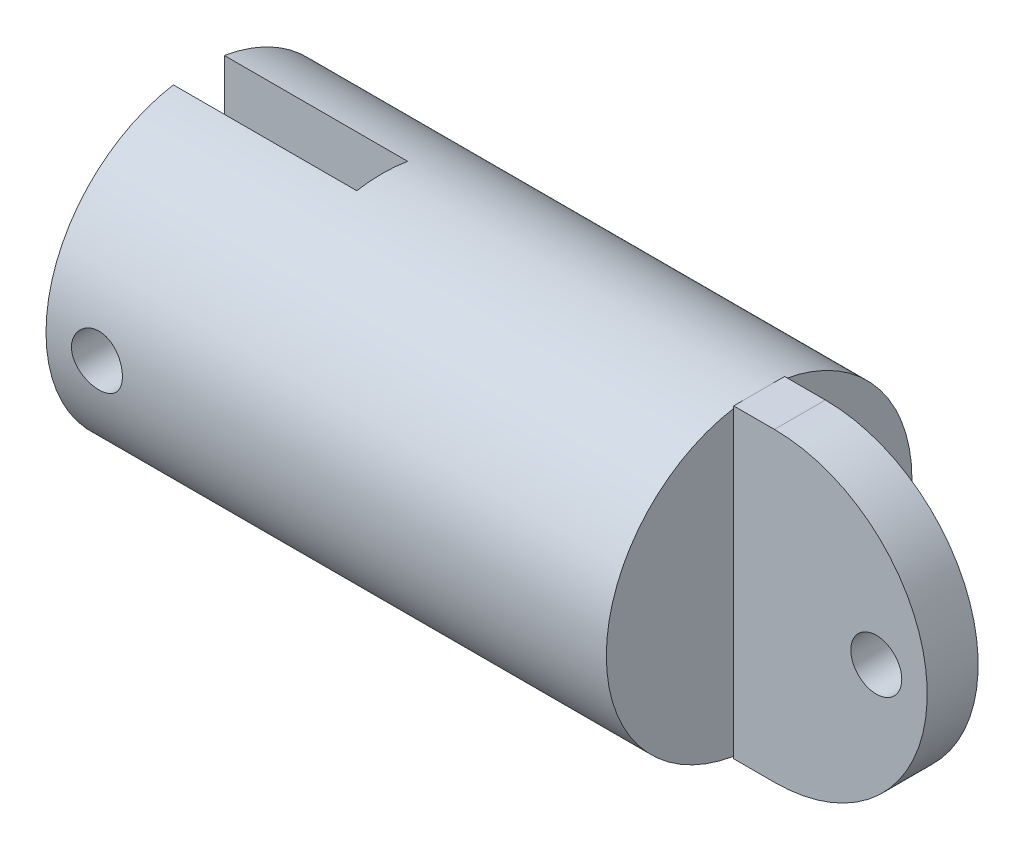
ISO-10303-21;
HEADER;
FILE_DESCRIPTION(('STEP AP214'),'2;1');
FILE_NAME('part.step','',(''),(''),'','','');
FILE_SCHEMA(('AUTOMOTIVE_DESIGN { 1 0 10303 214 1 1 1 1 }'));
ENDSEC;
DATA;
#1=APPLICATION_CONTEXT('core data for automotive mechanical design processes');
#2=APPLICATION_PROTOCOL_DEFINITION('international standard','automotive_design',2000,#1);
#3=PRODUCT_CONTEXT('',#1,'mechanical');
#4=PRODUCT('Part','Part','',(#3));
#5=PRODUCT_RELATED_PRODUCT_CATEGORY('part','',(#4));
#6=PRODUCT_DEFINITION_FORMATION('','',#4);
#7=PRODUCT_DEFINITION_CONTEXT('part definition',#1,'design');
#8=PRODUCT_DEFINITION('design','',#6,#7);
#9=PRODUCT_DEFINITION_SHAPE('','',#8);
#10=(LENGTH_UNIT() NAMED_UNIT(*) SI_UNIT(.MILLI.,.METRE.));
#11=(NAMED_UNIT(*) PLANE_ANGLE_UNIT() SI_UNIT($,.RADIAN.));
#12=(NAMED_UNIT(*) SI_UNIT($,.STERADIAN.) SOLID_ANGLE_UNIT());
#13=UNCERTAINTY_MEASURE_WITH_UNIT(LENGTH_MEASURE(1.E-05),#10,'distance_accuracy_value','');
#14=(GEOMETRIC_REPRESENTATION_CONTEXT(3) GLOBAL_UNCERTAINTY_ASSIGNED_CONTEXT((#13)) GLOBAL_UNIT_ASSIGNED_CONTEXT((#10,
#11,#12)) REPRESENTATION_CONTEXT('',''));
#15=CARTESIAN_POINT('',(0.,0.,0.));
#16=DIRECTION('',(0.,0.,1.));
#17=DIRECTION('',(1.,0.,0.));
#18=AXIS2_PLACEMENT_3D('',#15,#16,#17);
#19=CARTESIAN_POINT('',(0.,0.,0.));
#20=DIRECTION('',(1.,0.,0.));
#21=DIRECTION('',(0.,0.,-1.));
#22=AXIS2_PLACEMENT_3D('',#19,#20,#21);
#23=PLANE('',#22);
#24=DIRECTION('',(0.,1.,0.));
#25=VECTOR('',#24,1.);
#26=CARTESIAN_POINT('',(0.,15.,-2.5));
#27=LINE('',#26,#25);
#28=CARTESIAN_POINT('',(0.,-14.790199457749,-2.5));
#29=VERTEX_POINT('',#28);
#30=CARTESIAN_POINT('',(0.,14.790199457749,-2.5));
#31=VERTEX_POINT('',#30);
#32=EDGE_CURVE('E11',#29,#31,#27,.T.);
#33=ORIENTED_EDGE('',*,*,#32,.F.);
#34=CARTESIAN_POINT('',(0.,0.,0.));
#35=DIRECTION('',(1.,0.,0.));
#36=DIRECTION('',(0.,0.,-1.));
#37=AXIS2_PLACEMENT_3D('',#34,#35,#36);
#38=CIRCLE('',#37,15.);
#39=EDGE_CURVE('E271',#29,#31,#38,.T.);
#40=ORIENTED_EDGE('',*,*,#39,.T.);
#41=EDGE_LOOP('',(#33,#40));
#42=FACE_BOUND('',#41,.T.);
#43=ADVANCED_FACE('F38',(#42),#23,.T.);
#44=CARTESIAN_POINT('',(-55.,0.,0.));
#45=DIRECTION('',(1.,0.,0.));
#46=DIRECTION('',(0.,0.,-1.));
#47=AXIS2_PLACEMENT_3D('',#44,#45,#46);
#48=PLANE('',#47);
#49=CARTESIAN_POINT('',(-55.,0.,0.));
#50=DIRECTION('',(1.,0.,0.));
#51=DIRECTION('',(0.,0.,-1.));
#52=AXIS2_PLACEMENT_3D('',#49,#50,#51);
#53=CIRCLE('',#52,15.);
#54=CARTESIAN_POINT('',(-55.,-14.790199457749,-2.5));
#55=VERTEX_POINT('',#54);
#56=CARTESIAN_POINT('',(-55.,14.790199457749,-2.5));
#57=VERTEX_POINT('',#56);
#58=EDGE_CURVE('E255',#55,#57,#53,.T.);
#59=ORIENTED_EDGE('',*,*,#58,.F.);
#60=DIRECTION('',(0.,1.,0.));
#61=VECTOR('',#60,1.);
#62=CARTESIAN_POINT('',(-55.,0.,-2.5));
#63=LINE('',#62,#61);
#64=EDGE_CURVE('E256',#55,#57,#63,.T.);
#65=ORIENTED_EDGE('',*,*,#64,.T.);
#66=EDGE_LOOP('',(#59,#65));
#67=FACE_BOUND('',#66,.T.);
#68=ADVANCED_FACE('F235',(#67),#48,.F.);
#69=CARTESIAN_POINT('',(-55.,0.,0.));
#70=DIRECTION('',(1.,0.,0.));
#71=DIRECTION('',(0.,0.,-1.));
#72=AXIS2_PLACEMENT_3D('',#69,#70,#71);
#73=CYLINDRICAL_SURFACE('',#72,15.);
#74=CARTESIAN_POINT('',(-47.5,0.,-15.));
#75=CARTESIAN_POINT('',(-47.5000055889478,-0.139390904958215,-14.9999976116882));
#76=CARTESIAN_POINT('',(-47.5116972749689,-0.278857881838821,-14.9980367791303));
#77=CARTESIAN_POINT('',(-47.5581356587653,-0.553880221673043,-14.9904034494139));
#78=CARTESIAN_POINT('',(-47.5929035569116,-0.689431867959247,-14.9847275392389));
#79=CARTESIAN_POINT('',(-47.6844154485928,-0.952604747212645,-14.9703006823645));
#80=CARTESIAN_POINT('',(-47.7411414656406,-1.0802323684319,-14.9615522515919));
#81=CARTESIAN_POINT('',(-47.8749122920524,-1.32414184197795,-14.9419422708207));
#82=CARTESIAN_POINT('',(-47.951954777483,-1.44042498987859,-14.9310809625443));
#83=CARTESIAN_POINT('',(-48.1249550838205,-1.65947261429168,-14.9083331745831));
#84=CARTESIAN_POINT('',(-48.2210691146361,-1.76211290353497,-14.8964387181486));
#85=CARTESIAN_POINT('',(-48.4291479684728,-1.94988849865993,-14.8730262687673));
#86=CARTESIAN_POINT('',(-48.5411137914566,-2.03502269939097,-14.8615082996267));
#87=CARTESIAN_POINT('',(-48.7785709661971,-2.18586712560514,-14.8400756575978));
#88=CARTESIAN_POINT('',(-48.9041413368048,-2.25145455286101,-14.8301712909164));
#89=CARTESIAN_POINT('',(-49.1647095643006,-2.36055836541122,-14.8131978979467));
#90=CARTESIAN_POINT('',(-49.2997067836776,-2.40407624156562,-14.8061286801431));
#91=CARTESIAN_POINT('',(-49.5739802748565,-2.46741437778481,-14.7957053684276));
#92=CARTESIAN_POINT('',(-49.7132057365014,-2.4874490291354,-14.792317684857));
#93=CARTESIAN_POINT('',(-49.9930802768835,-2.50391672528988,-14.7895393893665));
#94=CARTESIAN_POINT('',(-50.1337292541673,-2.500351440389,-14.7901484945721));
#95=CARTESIAN_POINT('',(-50.4109278612755,-2.46989509839615,-14.7952642886356));
#96=CARTESIAN_POINT('',(-50.5475048035452,-2.44324488188977,-14.7997307331892));
#97=CARTESIAN_POINT('',(-50.8142213178291,-2.36775314040345,-14.8119949521101));
#98=CARTESIAN_POINT('',(-50.9443606688886,-2.31891085431974,-14.8197928407327));
#99=CARTESIAN_POINT('',(-51.1952288234409,-2.20017724609391,-14.837884793341));
#100=CARTESIAN_POINT('',(-51.3159094060812,-2.13018591387971,-14.8481906710733));
#101=CARTESIAN_POINT('',(-51.5439044005384,-1.97121201755743,-14.8701291841501));
#102=CARTESIAN_POINT('',(-51.6512177324549,-1.88222792065429,-14.8817619265429));
#103=CARTESIAN_POINT('',(-51.8508260858073,-1.68648221215906,-14.9052202787979));
#104=CARTESIAN_POINT('',(-51.9429185185401,-1.57951396387313,-14.9170464923165));
#105=CARTESIAN_POINT('',(-52.1078777626654,-1.35153524898165,-14.9394260139672));
#106=CARTESIAN_POINT('',(-52.1807444501832,-1.23052469190642,-14.9499793138975));
#107=CARTESIAN_POINT('',(-52.3052022271363,-0.97770591616671,-14.9686389289291));
#108=CARTESIAN_POINT('',(-52.3567754193313,-0.84588872556466,-14.9767431840745));
#109=CARTESIAN_POINT('',(-52.436994215246,-0.575298345602731,-14.9895750301266));
#110=CARTESIAN_POINT('',(-52.4656417369737,-0.436525739179469,-14.9943029035047));
#111=CARTESIAN_POINT('',(-52.4989213584611,-0.157709901301626,-14.9998112984269));
#112=CARTESIAN_POINT('',(-52.5038315718056,-0.017700737151014,-15.0006375301278));
#113=CARTESIAN_POINT('',(-52.4902386555719,0.261139772889886,-14.9983747442117));
#114=CARTESIAN_POINT('',(-52.4717364268663,0.399971163892037,-14.9952858772412));
#115=CARTESIAN_POINT('',(-52.4120751506645,0.671656175546762,-14.985568269382));
#116=CARTESIAN_POINT('',(-52.3710537916099,0.804540868385376,-14.9789610480131));
#117=CARTESIAN_POINT('',(-52.2676654818005,1.06154688486044,-14.9629446445536));
#118=CARTESIAN_POINT('',(-52.2052973323647,1.18566771590972,-14.9535353051202));
#119=CARTESIAN_POINT('',(-52.0603488753032,1.42283068946896,-14.9328451630241));
#120=CARTESIAN_POINT('',(-51.9775948438328,1.53576525093715,-14.9215485588702));
#121=CARTESIAN_POINT('',(-51.7944626846149,1.74624358550269,-14.898384673919));
#122=CARTESIAN_POINT('',(-51.6940832767233,1.84378623969658,-14.8865173517155));
#123=CARTESIAN_POINT('',(-51.4773024519286,2.021742779658,-14.8634017523585));
#124=CARTESIAN_POINT('',(-51.3607458344856,2.10196876111371,-14.8521611613711));
#125=CARTESIAN_POINT('',(-51.1156470308615,2.24170231029499,-14.8317152977788));
#126=CARTESIAN_POINT('',(-50.9871052247725,2.30121053476982,-14.8225099606602));
#127=CARTESIAN_POINT('',(-50.7222102671879,2.39753833147315,-14.807234536977));
#128=CARTESIAN_POINT('',(-50.5858919049695,2.43445143254795,-14.8011515431106));
#129=CARTESIAN_POINT('',(-50.3088798707782,2.48483545377828,-14.7927771683526));
#130=CARTESIAN_POINT('',(-50.1681865802679,2.49830841194617,-14.7904854578272));
#131=CARTESIAN_POINT('',(-49.8882948340376,2.50137286604736,-14.7899673308401));
#132=CARTESIAN_POINT('',(-49.7490996214247,2.49126013612519,-14.7916905650565));
#133=CARTESIAN_POINT('',(-49.4744207519492,2.44807983895685,-14.7988978145373));
#134=CARTESIAN_POINT('',(-49.3389370830581,2.41501234611248,-14.8043818176121));
#135=CARTESIAN_POINT('',(-49.0756415627074,2.3269744895949,-14.8184735628172));
#136=CARTESIAN_POINT('',(-48.947820989944,2.27202959060044,-14.8270776721967));
#137=CARTESIAN_POINT('',(-48.7031643308051,2.14182700391591,-14.8464436892221));
#138=CARTESIAN_POINT('',(-48.5863287896279,2.06656830874856,-14.857205703884));
#139=CARTESIAN_POINT('',(-48.3654644168922,1.89681888437215,-14.8798345404562));
#140=CARTESIAN_POINT('',(-48.2616039832997,1.80211056359365,-14.891712955763));
#141=CARTESIAN_POINT('',(-48.0711483955251,1.59660903138023,-14.9151437236084));
#142=CARTESIAN_POINT('',(-47.9845572313618,1.48581211291264,-14.9266960002655));
#143=CARTESIAN_POINT('',(-47.8305517318001,1.25036916964028,-14.9482652964222));
#144=CARTESIAN_POINT('',(-47.7632739606871,1.12563278753282,-14.958271162531));
#145=CARTESIAN_POINT('',(-47.6507305153901,0.866513069378982,-14.9755116760178));
#146=CARTESIAN_POINT('',(-47.6054429189203,0.73213949483001,-14.9827490817748));
#147=CARTESIAN_POINT('',(-47.5479947258733,0.4977033100454,-14.9920579083296));
#148=CARTESIAN_POINT('',(-47.530025530384,0.399058830298447,-14.9950202727336));
#149=CARTESIAN_POINT('',(-47.5060262621552,0.200289310319809,-14.9989921598612));
#150=CARTESIAN_POINT('',(-47.4999959838626,0.100164295608494,-15.0000017162064));
#151=CARTESIAN_POINT('',(-47.5,0.,-15.));
#152=B_SPLINE_CURVE_WITH_KNOTS('',3,(#74,#75,#76,#77,#78,#79,#80,#81,#82,#83,#84,#85,#86,#87,
#88,#89,#90,#91,#92,#93,#94,#95,#96,#97,#98,#99,#100,#101,#102,#103,#104,#105,#106,#107,#108,
#109,#110,#111,#112,#113,#114,#115,#116,#117,#118,#119,#120,#121,#122,#123,#124,#125,#126,#127,
#128,#129,#130,#131,#132,#133,#134,#135,#136,#137,#138,#139,#140,#141,#142,#143,#144,#145,#146,
#147,#148,#149,#150,#151),.UNSPECIFIED.,.T.,.F.,(4,2,2,2,2,2,2,2,2,2,2,2,2,2,2,2,2,2,2,2,2,2,2,
2,2,2,2,2,2,2,2,2,2,2,2,2,2,2,4),(0.,0.41780658493851,0.835997545695421,1.25384686702527,
1.67164841267479,2.09302491062332,2.51442800169857,2.93842520823841,3.36239376876182,
3.78246077103424,4.20249804320887,4.61820521760409,5.03392665025382,5.45164556632558,
5.86939820680574,6.29232769911327,6.71525991635848,7.13854688915904,7.56179844521149,
7.98007883491398,8.3983431303586,8.81407807006416,9.22983635826067,9.64926825627025,
10.0687306305428,10.4925382200762,10.9163323737594,11.3383602234177,11.7603513778662,
12.177079095227,12.5938054618813,13.0100481822623,13.4263115502934,13.8475138419339,
14.2688133387897,14.693022316072,15.1168075213007,15.4170424816402,15.7172722727697),.UNSPECIFIED.);
#153=CARTESIAN_POINT('',(-47.5,0.,-15.));
#154=VERTEX_POINT('',#153);
#155=EDGE_CURVE('E203',#154,#154,#152,.T.);
#156=ORIENTED_EDGE('',*,*,#155,.F.);
#157=EDGE_LOOP('',(#156));
#158=FACE_BOUND('',#157,.T.);
#159=CARTESIAN_POINT('',(-47.5,0.,15.));
#160=CARTESIAN_POINT('',(-47.5000055889478,0.139390904958215,14.9999976116882));
#161=CARTESIAN_POINT('',(-47.5116972749689,0.278857881838821,14.9980367791303));
#162=CARTESIAN_POINT('',(-47.5581356587653,0.553880221673043,14.9904034494139));
#163=CARTESIAN_POINT('',(-47.5929035569116,0.689431867959247,14.9847275392389));
#164=CARTESIAN_POINT('',(-47.6844154485928,0.952604747212645,14.9703006823645));
#165=CARTESIAN_POINT('',(-47.7411414656406,1.0802323684319,14.9615522515919));
#166=CARTESIAN_POINT('',(-47.8749122920524,1.32414184197795,14.9419422708207));
#167=CARTESIAN_POINT('',(-47.951954777483,1.44042498987859,14.9310809625443));
#168=CARTESIAN_POINT('',(-48.1249550838205,1.65947261429168,14.9083331745831));
#169=CARTESIAN_POINT('',(-48.2210691146361,1.76211290353497,14.8964387181486));
#170=CARTESIAN_POINT('',(-48.4291479684728,1.94988849865993,14.8730262687673));
#171=CARTESIAN_POINT('',(-48.5411137914566,2.03502269939097,14.8615082996267));
#172=CARTESIAN_POINT('',(-48.7785709661971,2.18586712560514,14.8400756575978));
#173=CARTESIAN_POINT('',(-48.9041413368048,2.25145455286101,14.8301712909164));
#174=CARTESIAN_POINT('',(-49.1647095643006,2.36055836541122,14.8131978979467));
#175=CARTESIAN_POINT('',(-49.2997067836776,2.40407624156562,14.8061286801431));
#176=CARTESIAN_POINT('',(-49.5739802748565,2.46741437778481,14.7957053684276));
#177=CARTESIAN_POINT('',(-49.7132057365014,2.4874490291354,14.792317684857));
#178=CARTESIAN_POINT('',(-49.9930802768835,2.50391672528988,14.7895393893665));
#179=CARTESIAN_POINT('',(-50.1337292541673,2.500351440389,14.7901484945721));
#180=CARTESIAN_POINT('',(-50.4109278612755,2.46989509839615,14.7952642886356));
#181=CARTESIAN_POINT('',(-50.5475048035452,2.44324488188977,14.7997307331892));
#182=CARTESIAN_POINT('',(-50.8142213178291,2.36775314040345,14.8119949521101));
#183=CARTESIAN_POINT('',(-50.9443606688886,2.31891085431974,14.8197928407327));
#184=CARTESIAN_POINT('',(-51.1952288234409,2.20017724609391,14.837884793341));
#185=CARTESIAN_POINT('',(-51.3159094060812,2.13018591387971,14.8481906710733));
#186=CARTESIAN_POINT('',(-51.5439044005384,1.97121201755743,14.8701291841501));
#187=CARTESIAN_POINT('',(-51.6512177324549,1.88222792065429,14.8817619265429));
#188=CARTESIAN_POINT('',(-51.8508260858073,1.68648221215906,14.9052202787979));
#189=CARTESIAN_POINT('',(-51.9429185185401,1.57951396387313,14.9170464923165));
#190=CARTESIAN_POINT('',(-52.1078777626654,1.35153524898165,14.9394260139672));
#191=CARTESIAN_POINT('',(-52.1807444501832,1.23052469190642,14.9499793138975));
#192=CARTESIAN_POINT('',(-52.3052022271363,0.97770591616671,14.9686389289291));
#193=CARTESIAN_POINT('',(-52.3567754193313,0.84588872556466,14.9767431840745));
#194=CARTESIAN_POINT('',(-52.436994215246,0.575298345602731,14.9895750301266));
#195=CARTESIAN_POINT('',(-52.4656417369737,0.436525739179469,14.9943029035047));
#196=CARTESIAN_POINT('',(-52.4989213584611,0.157709901301626,14.9998112984269));
#197=CARTESIAN_POINT('',(-52.5038315718056,0.017700737151014,15.0006375301278));
#198=CARTESIAN_POINT('',(-52.4902386555719,-0.261139772889886,14.9983747442117));
#199=CARTESIAN_POINT('',(-52.4717364268663,-0.399971163892037,14.9952858772412));
#200=CARTESIAN_POINT('',(-52.4120751506645,-0.671656175546762,14.985568269382));
#201=CARTESIAN_POINT('',(-52.3710537916099,-0.804540868385376,14.9789610480131));
#202=CARTESIAN_POINT('',(-52.2676654818005,-1.06154688486044,14.9629446445536));
#203=CARTESIAN_POINT('',(-52.2052973323647,-1.18566771590972,14.9535353051202));
#204=CARTESIAN_POINT('',(-52.0603488753032,-1.42283068946896,14.9328451630241));
#205=CARTESIAN_POINT('',(-51.9775948438328,-1.53576525093715,14.9215485588702));
#206=CARTESIAN_POINT('',(-51.7944626846149,-1.74624358550269,14.898384673919));
#207=CARTESIAN_POINT('',(-51.6940832767233,-1.84378623969658,14.8865173517155));
#208=CARTESIAN_POINT('',(-51.4773024519286,-2.021742779658,14.8634017523585));
#209=CARTESIAN_POINT('',(-51.3607458344856,-2.10196876111371,14.8521611613711));
#210=CARTESIAN_POINT('',(-51.1156470308615,-2.24170231029499,14.8317152977788));
#211=CARTESIAN_POINT('',(-50.9871052247725,-2.30121053476982,14.8225099606602));
#212=CARTESIAN_POINT('',(-50.7222102671879,-2.39753833147315,14.807234536977));
#213=CARTESIAN_POINT('',(-50.5858919049695,-2.43445143254795,14.8011515431106));
#214=CARTESIAN_POINT('',(-50.3088798707782,-2.48483545377828,14.7927771683526));
#215=CARTESIAN_POINT('',(-50.1681865802679,-2.49830841194617,14.7904854578272));
#216=CARTESIAN_POINT('',(-49.8882948340376,-2.50137286604736,14.7899673308401));
#217=CARTESIAN_POINT('',(-49.7490996214247,-2.49126013612519,14.7916905650565));
#218=CARTESIAN_POINT('',(-49.4744207519492,-2.44807983895685,14.7988978145373));
#219=CARTESIAN_POINT('',(-49.3389370830581,-2.41501234611248,14.8043818176121));
#220=CARTESIAN_POINT('',(-49.0756415627074,-2.3269744895949,14.8184735628172));
#221=CARTESIAN_POINT('',(-48.947820989944,-2.27202959060044,14.8270776721967));
#222=CARTESIAN_POINT('',(-48.7031643308051,-2.14182700391591,14.8464436892221));
#223=CARTESIAN_POINT('',(-48.5863287896279,-2.06656830874856,14.857205703884));
#224=CARTESIAN_POINT('',(-48.3654644168922,-1.89681888437215,14.8798345404562));
#225=CARTESIAN_POINT('',(-48.2616039832997,-1.80211056359365,14.891712955763));
#226=CARTESIAN_POINT('',(-48.0711483955251,-1.59660903138023,14.9151437236084));
#227=CARTESIAN_POINT('',(-47.9845572313618,-1.48581211291264,14.9266960002655));
#228=CARTESIAN_POINT('',(-47.8305517318001,-1.25036916964028,14.9482652964222));
#229=CARTESIAN_POINT('',(-47.7632739606871,-1.12563278753282,14.958271162531));
#230=CARTESIAN_POINT('',(-47.6507305153901,-0.866513069378982,14.9755116760178));
#231=CARTESIAN_POINT('',(-47.6054429189203,-0.73213949483001,14.9827490817748));
#232=CARTESIAN_POINT('',(-47.5479947258733,-0.4977033100454,14.9920579083296));
#233=CARTESIAN_POINT('',(-47.530025530384,-0.399058830298447,14.9950202727336));
#234=CARTESIAN_POINT('',(-47.5060262621552,-0.200289310319809,14.9989921598612));
#235=CARTESIAN_POINT('',(-47.4999959838626,-0.100164295608494,15.0000017162064));
#236=CARTESIAN_POINT('',(-47.5,0.,15.));
#237=B_SPLINE_CURVE_WITH_KNOTS('',3,(#159,#160,#161,#162,#163,#164,#165,#166,#167,#168,#169,
#170,#171,#172,#173,#174,#175,#176,#177,#178,#179,#180,#181,#182,#183,#184,#185,#186,#187,#188,
#189,#190,#191,#192,#193,#194,#195,#196,#197,#198,#199,#200,#201,#202,#203,#204,#205,#206,#207,
#208,#209,#210,#211,#212,#213,#214,#215,#216,#217,#218,#219,#220,#221,#222,#223,#224,#225,#226,
#227,#228,#229,#230,#231,#232,#233,#234,#235,#236),.UNSPECIFIED.,.T.,.F.,(4,2,2,2,2,2,2,2,2,2,2,
2,2,2,2,2,2,2,2,2,2,2,2,2,2,2,2,2,2,2,2,2,2,2,2,2,2,2,4),(0.,0.41780658493851,0.835997545695421,
1.25384686702527,1.67164841267479,2.09302491062332,2.51442800169857,2.93842520823841,
3.36239376876182,3.78246077103424,4.20249804320887,4.61820521760409,5.03392665025382,
5.45164556632558,5.86939820680574,6.29232769911327,6.71525991635848,7.13854688915904,
7.56179844521149,7.98007883491398,8.3983431303586,8.81407807006416,9.22983635826067,
9.64926825627025,10.0687306305428,10.4925382200762,10.9163323737594,11.3383602234177,
11.7603513778662,12.177079095227,12.5938054618813,13.0100481822623,13.4263115502934,
13.8475138419339,14.2688133387897,14.693022316072,15.1168075213007,15.4170424816402,
15.7172722727697),.UNSPECIFIED.);
#238=CARTESIAN_POINT('',(-47.5,0.,15.));
#239=VERTEX_POINT('',#238);
#240=EDGE_CURVE('E195',#239,#239,#237,.T.);
#241=ORIENTED_EDGE('',*,*,#240,.F.);
#242=EDGE_LOOP('',(#241));
#243=FACE_BOUND('',#242,.T.);
#244=DIRECTION('',(1.,0.,0.));
#245=VECTOR('',#244,1.);
#246=CARTESIAN_POINT('',(-55.,-14.790199457749,-2.5));
#247=LINE('',#246,#245);
#248=CARTESIAN_POINT('',(-37.,-14.790199457749,-2.5));
#249=VERTEX_POINT('',#248);
#250=EDGE_CURVE('E296',#55,#249,#247,.T.);
#251=ORIENTED_EDGE('',*,*,#250,.F.);
#252=ORIENTED_EDGE('',*,*,#58,.T.);
#253=DIRECTION('',(1.,0.,0.));
#254=VECTOR('',#253,1.);
#255=CARTESIAN_POINT('',(-55.,14.790199457749,-2.5));
#256=LINE('',#255,#254);
#257=CARTESIAN_POINT('',(-37.,14.790199457749,-2.5));
#258=VERTEX_POINT('',#257);
#259=EDGE_CURVE('E273',#258,#57,#256,.F.);
#260=ORIENTED_EDGE('',*,*,#259,.F.);
#261=CARTESIAN_POINT('',(-37.,0.,0.));
#262=DIRECTION('',(1.,0.,0.));
#263=DIRECTION('',(0.,0.,-1.));
#264=AXIS2_PLACEMENT_3D('',#261,#262,#263);
#265=CIRCLE('',#264,15.);
#266=CARTESIAN_POINT('',(-37.,14.790199457749,2.5));
#267=VERTEX_POINT('',#266);
#268=EDGE_CURVE('E281',#267,#258,#265,.F.);
#269=ORIENTED_EDGE('',*,*,#268,.F.);
#270=DIRECTION('',(1.,0.,0.));
#271=VECTOR('',#270,1.);
#272=CARTESIAN_POINT('',(-55.,14.790199457749,2.5));
#273=LINE('',#272,#271);
#274=CARTESIAN_POINT('',(-55.,14.790199457749,2.5));
#275=VERTEX_POINT('',#274);
#276=EDGE_CURVE('E323',#275,#267,#273,.T.);
#277=ORIENTED_EDGE('',*,*,#276,.F.);
#278=CARTESIAN_POINT('',(-55.,-14.790199457749,2.5));
#279=VERTEX_POINT('',#278);
#280=EDGE_CURVE('E261',#275,#279,#53,.T.);
#281=ORIENTED_EDGE('',*,*,#280,.T.);
#282=DIRECTION('',(1.,0.,0.));
#283=VECTOR('',#282,1.);
#284=CARTESIAN_POINT('',(-55.,-14.790199457749,2.5));
#285=LINE('',#284,#283);
#286=CARTESIAN_POINT('',(-37.,-14.790199457749,2.5));
#287=VERTEX_POINT('',#286);
#288=EDGE_CURVE('E320',#287,#279,#285,.F.);
#289=ORIENTED_EDGE('',*,*,#288,.F.);
#290=EDGE_CURVE('E283',#249,#287,#265,.F.);
#291=ORIENTED_EDGE('',*,*,#290,.F.);
#292=EDGE_LOOP('',(#251,#252,#260,#269,#277,#281,#289,#291));
#293=FACE_BOUND('',#292,.T.);
#294=CARTESIAN_POINT('',(0.,15.,0.));
#295=VERTEX_POINT('',#294);
#296=EDGE_CURVE('E262',#31,#295,#38,.T.);
#297=ORIENTED_EDGE('',*,*,#296,.F.);
#298=ORIENTED_EDGE('',*,*,#39,.F.);
#299=CARTESIAN_POINT('',(0.,-15.,0.));
#300=VERTEX_POINT('',#299);
#301=EDGE_CURVE('E63',#300,#29,#38,.T.);
#302=ORIENTED_EDGE('',*,*,#301,.F.);
#303=CARTESIAN_POINT('',(0.,-14.790199457749,2.5));
#304=VERTEX_POINT('',#303);
#305=EDGE_CURVE('E312',#304,#300,#38,.T.);
#306=ORIENTED_EDGE('',*,*,#305,.F.);
#307=CARTESIAN_POINT('',(0.,14.790199457749,2.5));
#308=VERTEX_POINT('',#307);
#309=EDGE_CURVE('E315',#308,#304,#38,.T.);
#310=ORIENTED_EDGE('',*,*,#309,.F.);
#311=EDGE_CURVE('E269',#295,#308,#38,.T.);
#312=ORIENTED_EDGE('',*,*,#311,.F.);
#313=EDGE_LOOP('',(#297,#298,#302,#306,#310,#312));
#314=FACE_BOUND('',#313,.T.);
#315=ADVANCED_FACE('F40',(#158,#243,#293,#314),#73,.T.);
#316=ORIENTED_EDGE('',*,*,#280,.F.);
#317=DIRECTION('',(0.,-1.,0.));
#318=VECTOR('',#317,1.);
#319=CARTESIAN_POINT('',(-55.,0.,2.5));
#320=LINE('',#319,#318);
#321=EDGE_CURVE('E267',#275,#279,#320,.T.);
#322=ORIENTED_EDGE('',*,*,#321,.T.);
#323=EDGE_LOOP('',(#316,#322));
#324=FACE_BOUND('',#323,.T.);
#325=ADVANCED_FACE('F232',(#324),#48,.F.);
#326=DIRECTION('',(0.,-1.,0.));
#327=VECTOR('',#326,1.);
#328=CARTESIAN_POINT('',(0.,15.,2.5));
#329=LINE('',#328,#327);
#330=EDGE_CURVE('E49',#308,#304,#329,.T.);
#331=ORIENTED_EDGE('',*,*,#330,.F.);
#332=ORIENTED_EDGE('',*,*,#309,.T.);
#333=EDGE_LOOP('',(#331,#332));
#334=FACE_BOUND('',#333,.T.);
#335=ADVANCED_FACE('F223',(#334),#23,.T.);
#336=CARTESIAN_POINT('',(-55.,-15.,-2.5));
#337=DIRECTION('',(0.,0.,-1.));
#338=DIRECTION('',(-1.,0.,0.));
#339=AXIS2_PLACEMENT_3D('',#336,#337,#338);
#340=PLANE('',#339);
#341=CARTESIAN_POINT('',(-50.,0.,-2.5));
#342=DIRECTION('',(0.,0.,-1.));
#343=DIRECTION('',(-1.,0.,0.));
#344=AXIS2_PLACEMENT_3D('',#341,#342,#343);
#345=CIRCLE('',#344,2.5);
#346=CARTESIAN_POINT('',(-52.5,0.,-2.5));
#347=VERTEX_POINT('',#346);
#348=EDGE_CURVE('E191',#347,#347,#345,.T.);
#349=ORIENTED_EDGE('',*,*,#348,.T.);
#350=EDGE_LOOP('',(#349));
#351=FACE_BOUND('',#350,.T.);
#352=ORIENTED_EDGE('',*,*,#259,.T.);
#353=ORIENTED_EDGE('',*,*,#64,.F.);
#354=ORIENTED_EDGE('',*,*,#250,.T.);
#355=DIRECTION('',(0.,1.,0.));
#356=VECTOR('',#355,1.);
#357=CARTESIAN_POINT('',(-37.,-15.,-2.5));
#358=LINE('',#357,#356);
#359=EDGE_CURVE('E329',#249,#258,#358,.T.);
#360=ORIENTED_EDGE('',*,*,#359,.T.);
#361=EDGE_LOOP('',(#352,#353,#354,#360));
#362=FACE_BOUND('',#361,.T.);
#363=ADVANCED_FACE('F218',(#351,#362),#340,.F.);
#364=CARTESIAN_POINT('',(-37.,-15.,-2.5));
#365=DIRECTION('',(1.,0.,0.));
#366=DIRECTION('',(0.,0.,-1.));
#367=AXIS2_PLACEMENT_3D('',#364,#365,#366);
#368=PLANE('',#367);
#369=ORIENTED_EDGE('',*,*,#359,.F.);
#370=ORIENTED_EDGE('',*,*,#290,.T.);
#371=DIRECTION('',(0.,1.,0.));
#372=VECTOR('',#371,1.);
#373=CARTESIAN_POINT('',(-37.,-15.,2.5));
#374=LINE('',#373,#372);
#375=EDGE_CURVE('E330',#287,#267,#374,.T.);
#376=ORIENTED_EDGE('',*,*,#375,.T.);
#377=ORIENTED_EDGE('',*,*,#268,.T.);
#378=EDGE_LOOP('',(#369,#370,#376,#377));
#379=FACE_BOUND('',#378,.T.);
#380=ADVANCED_FACE('F222',(#379),#368,.F.);
#381=CARTESIAN_POINT('',(-55.,-15.,2.5));
#382=DIRECTION('',(0.,0.,1.));
#383=DIRECTION('',(1.,0.,0.));
#384=AXIS2_PLACEMENT_3D('',#381,#382,#383);
#385=PLANE('',#384);
#386=CARTESIAN_POINT('',(-50.,0.,2.5));
#387=DIRECTION('',(0.,0.,1.));
#388=DIRECTION('',(1.,0.,0.));
#389=AXIS2_PLACEMENT_3D('',#386,#387,#388);
#390=CIRCLE('',#389,2.5);
#391=CARTESIAN_POINT('',(-47.5,0.,2.5));
#392=VERTEX_POINT('',#391);
#393=EDGE_CURVE('E190',#392,#392,#390,.T.);
#394=ORIENTED_EDGE('',*,*,#393,.T.);
#395=EDGE_LOOP('',(#394));
#396=FACE_BOUND('',#395,.T.);
#397=ORIENTED_EDGE('',*,*,#288,.T.);
#398=ORIENTED_EDGE('',*,*,#321,.F.);
#399=ORIENTED_EDGE('',*,*,#276,.T.);
#400=ORIENTED_EDGE('',*,*,#375,.F.);
#401=EDGE_LOOP('',(#397,#398,#399,#400));
#402=FACE_BOUND('',#401,.T.);
#403=ADVANCED_FACE('F227',(#396,#402),#385,.F.);
#404=CARTESIAN_POINT('',(-50.,0.,-15.));
#405=DIRECTION('',(0.,0.,1.));
#406=DIRECTION('',(1.,0.,0.));
#407=AXIS2_PLACEMENT_3D('',#404,#405,#406);
#408=CYLINDRICAL_SURFACE('',#407,2.5);
#409=ORIENTED_EDGE('',*,*,#240,.T.);
#410=EDGE_LOOP('',(#409));
#411=FACE_BOUND('',#410,.T.);
#412=ORIENTED_EDGE('',*,*,#393,.F.);
#413=EDGE_LOOP('',(#412));
#414=FACE_BOUND('',#413,.T.);
#415=ADVANCED_FACE('F214',(#411,#414),#408,.F.);
#416=ORIENTED_EDGE('',*,*,#155,.T.);
#417=EDGE_LOOP('',(#416));
#418=FACE_BOUND('',#417,.T.);
#419=ORIENTED_EDGE('',*,*,#348,.F.);
#420=EDGE_LOOP('',(#419));
#421=FACE_BOUND('',#420,.T.);
#422=ADVANCED_FACE('F208',(#418,#421),#408,.F.);
#423=CARTESIAN_POINT('',(0.,0.,0.));
#424=DIRECTION('',(-1.,0.,0.));
#425=DIRECTION('',(0.,0.,1.));
#426=AXIS2_PLACEMENT_3D('',#423,#424,#425);
#427=PLANE('',#426);
#428=CARTESIAN_POINT('',(0.,15.,-2.5));
#429=VERTEX_POINT('',#428);
#430=EDGE_CURVE('E52',#31,#429,#27,.T.);
#431=ORIENTED_EDGE('',*,*,#430,.F.);
#432=ORIENTED_EDGE('',*,*,#296,.T.);
#433=DIRECTION('',(0.,0.,1.));
#434=VECTOR('',#433,1.);
#435=CARTESIAN_POINT('',(0.,15.,2.5));
#436=LINE('',#435,#434);
#437=EDGE_CURVE('E170',#429,#295,#436,.T.);
#438=ORIENTED_EDGE('',*,*,#437,.F.);
#439=EDGE_LOOP('',(#431,#432,#438));
#440=FACE_BOUND('',#439,.T.);
#441=ADVANCED_FACE('F213',(#440),#427,.T.);
#442=CARTESIAN_POINT('',(0.,15.,2.5));
#443=VERTEX_POINT('',#442);
#444=EDGE_CURVE('E163',#295,#443,#436,.T.);
#445=ORIENTED_EDGE('',*,*,#444,.F.);
#446=ORIENTED_EDGE('',*,*,#311,.T.);
#447=EDGE_CURVE('E174',#443,#308,#329,.T.);
#448=ORIENTED_EDGE('',*,*,#447,.F.);
#449=EDGE_LOOP('',(#445,#446,#448));
#450=FACE_BOUND('',#449,.T.);
#451=ADVANCED_FACE('F346',(#450),#427,.T.);
#452=CARTESIAN_POINT('',(0.,-15.,2.5));
#453=VERTEX_POINT('',#452);
#454=EDGE_CURVE('E150',#304,#453,#329,.T.);
#455=ORIENTED_EDGE('',*,*,#454,.F.);
#456=ORIENTED_EDGE('',*,*,#305,.T.);
#457=DIRECTION('',(0.,0.,-1.));
#458=VECTOR('',#457,1.);
#459=CARTESIAN_POINT('',(0.,-15.,2.5));
#460=LINE('',#459,#458);
#461=EDGE_CURVE('E178',#453,#300,#460,.T.);
#462=ORIENTED_EDGE('',*,*,#461,.F.);
#463=EDGE_LOOP('',(#455,#456,#462));
#464=FACE_BOUND('',#463,.T.);
#465=ADVANCED_FACE('F350',(#464),#427,.T.);
#466=CARTESIAN_POINT('',(4.,15.,2.5));
#467=DIRECTION('',(0.,-1.,0.));
#468=DIRECTION('',(0.,0.,-1.));
#469=AXIS2_PLACEMENT_3D('',#466,#467,#468);
#470=PLANE('',#469);
#471=ORIENTED_EDGE('',*,*,#437,.T.);
#472=ORIENTED_EDGE('',*,*,#444,.T.);
#473=DIRECTION('',(-1.,0.,0.));
#474=VECTOR('',#473,1.);
#475=CARTESIAN_POINT('',(4.,15.,2.5));
#476=LINE('',#475,#474);
#477=CARTESIAN_POINT('',(4.,15.,2.5));
#478=VERTEX_POINT('',#477);
#479=EDGE_CURVE('E152',#478,#443,#476,.T.);
#480=ORIENTED_EDGE('',*,*,#479,.F.);
#481=DIRECTION('',(0.,0.,1.));
#482=VECTOR('',#481,1.);
#483=CARTESIAN_POINT('',(4.,15.,2.5));
#484=LINE('',#483,#482);
#485=CARTESIAN_POINT('',(4.,15.,-2.5));
#486=VERTEX_POINT('',#485);
#487=EDGE_CURVE('E140',#486,#478,#484,.T.);
#488=ORIENTED_EDGE('',*,*,#487,.F.);
#489=DIRECTION('',(-1.,0.,0.));
#490=VECTOR('',#489,1.);
#491=CARTESIAN_POINT('',(4.,15.,-2.5));
#492=LINE('',#491,#490);
#493=EDGE_CURVE('E139',#486,#429,#492,.T.);
#494=ORIENTED_EDGE('',*,*,#493,.T.);
#495=EDGE_LOOP('',(#471,#472,#480,#488,#494));
#496=FACE_BOUND('',#495,.T.);
#497=ADVANCED_FACE('F216',(#496),#470,.F.);
#498=CARTESIAN_POINT('',(4.,15.,2.5));
#499=DIRECTION('',(0.,0.,-1.));
#500=DIRECTION('',(0.,1.,0.));
#501=AXIS2_PLACEMENT_3D('',#498,#499,#500);
#502=PLANE('',#501);
#503=CARTESIAN_POINT('',(14.,0.,2.5));
#504=DIRECTION('',(0.,0.,-1.));
#505=DIRECTION('',(0.,1.,0.));
#506=AXIS2_PLACEMENT_3D('',#503,#504,#505);
#507=CIRCLE('',#506,2.5);
#508=CARTESIAN_POINT('',(14.,2.5,2.5));
#509=VERTEX_POINT('',#508);
#510=EDGE_CURVE('E159',#509,#509,#507,.T.);
#511=ORIENTED_EDGE('',*,*,#510,.T.);
#512=EDGE_LOOP('',(#511));
#513=FACE_BOUND('',#512,.T.);
#514=ORIENTED_EDGE('',*,*,#447,.T.);
#515=ORIENTED_EDGE('',*,*,#330,.T.);
#516=ORIENTED_EDGE('',*,*,#454,.T.);
#517=DIRECTION('',(-1.,0.,0.));
#518=VECTOR('',#517,1.);
#519=CARTESIAN_POINT('',(4.,-15.,2.5));
#520=LINE('',#519,#518);
#521=CARTESIAN_POINT('',(4.,-15.,2.5));
#522=VERTEX_POINT('',#521);
#523=EDGE_CURVE('E130',#522,#453,#520,.T.);
#524=ORIENTED_EDGE('',*,*,#523,.F.);
#525=CARTESIAN_POINT('',(4.,0.,2.5));
#526=DIRECTION('',(0.,0.,1.));
#527=DIRECTION('',(1.,0.,0.));
#528=AXIS2_PLACEMENT_3D('',#525,#526,#527);
#529=CIRCLE('',#528,15.);
#530=EDGE_CURVE('E147',#522,#478,#529,.T.);
#531=ORIENTED_EDGE('',*,*,#530,.T.);
#532=ORIENTED_EDGE('',*,*,#479,.T.);
#533=EDGE_LOOP('',(#514,#515,#516,#524,#531,#532));
#534=FACE_BOUND('',#533,.T.);
#535=ADVANCED_FACE('F145',(#513,#534),#502,.F.);
#536=CARTESIAN_POINT('',(4.,-15.,2.5));
#537=DIRECTION('',(0.,1.,0.));
#538=DIRECTION('',(0.,0.,1.));
#539=AXIS2_PLACEMENT_3D('',#536,#537,#538);
#540=PLANE('',#539);
#541=ORIENTED_EDGE('',*,*,#461,.T.);
#542=CARTESIAN_POINT('',(0.,-15.,-2.5));
#543=VERTEX_POINT('',#542);
#544=EDGE_CURVE('E177',#300,#543,#460,.T.);
#545=ORIENTED_EDGE('',*,*,#544,.T.);
#546=DIRECTION('',(-1.,0.,0.));
#547=VECTOR('',#546,1.);
#548=CARTESIAN_POINT('',(4.,-15.,-2.5));
#549=LINE('',#548,#547);
#550=CARTESIAN_POINT('',(4.,-15.,-2.5));
#551=VERTEX_POINT('',#550);
#552=EDGE_CURVE('E133',#551,#543,#549,.T.);
#553=ORIENTED_EDGE('',*,*,#552,.F.);
#554=DIRECTION('',(0.,0.,-1.));
#555=VECTOR('',#554,1.);
#556=CARTESIAN_POINT('',(4.,-15.,2.5));
#557=LINE('',#556,#555);
#558=EDGE_CURVE('E126',#522,#551,#557,.T.);
#559=ORIENTED_EDGE('',*,*,#558,.F.);
#560=ORIENTED_EDGE('',*,*,#523,.T.);
#561=EDGE_LOOP('',(#541,#545,#553,#559,#560));
#562=FACE_BOUND('',#561,.T.);
#563=ADVANCED_FACE('F129',(#562),#540,.F.);
#564=CARTESIAN_POINT('',(4.,15.,-2.5));
#565=DIRECTION('',(0.,0.,1.));
#566=DIRECTION('',(0.,-1.,0.));
#567=AXIS2_PLACEMENT_3D('',#564,#565,#566);
#568=PLANE('',#567);
#569=CARTESIAN_POINT('',(14.,0.,-2.5));
#570=DIRECTION('',(0.,0.,1.));
#571=DIRECTION('',(0.,-1.,0.));
#572=AXIS2_PLACEMENT_3D('',#569,#570,#571);
#573=CIRCLE('',#572,2.5);
#574=CARTESIAN_POINT('',(14.,-2.5,-2.5));
#575=VERTEX_POINT('',#574);
#576=EDGE_CURVE('E43',#575,#575,#573,.T.);
#577=ORIENTED_EDGE('',*,*,#576,.T.);
#578=EDGE_LOOP('',(#577));
#579=FACE_BOUND('',#578,.T.);
#580=EDGE_CURVE('E51',#543,#29,#27,.T.);
#581=ORIENTED_EDGE('',*,*,#580,.T.);
#582=ORIENTED_EDGE('',*,*,#32,.T.);
#583=ORIENTED_EDGE('',*,*,#430,.T.);
#584=ORIENTED_EDGE('',*,*,#493,.F.);
#585=CARTESIAN_POINT('',(4.,0.,-2.5));
#586=DIRECTION('',(0.,0.,1.));
#587=DIRECTION('',(1.,0.,0.));
#588=AXIS2_PLACEMENT_3D('',#585,#586,#587);
#589=CIRCLE('',#588,15.);
#590=EDGE_CURVE('E158',#551,#486,#589,.T.);
#591=ORIENTED_EDGE('',*,*,#590,.F.);
#592=ORIENTED_EDGE('',*,*,#552,.T.);
#593=EDGE_LOOP('',(#581,#582,#583,#584,#591,#592));
#594=FACE_BOUND('',#593,.T.);
#595=ADVANCED_FACE('F306',(#579,#594),#568,.F.);
#596=ORIENTED_EDGE('',*,*,#544,.F.);
#597=ORIENTED_EDGE('',*,*,#301,.T.);
#598=ORIENTED_EDGE('',*,*,#580,.F.);
#599=EDGE_LOOP('',(#596,#597,#598));
#600=FACE_BOUND('',#599,.T.);
#601=ADVANCED_FACE('F310',(#600),#427,.T.);
#602=CARTESIAN_POINT('',(4.,0.,-2.5));
#603=DIRECTION('',(0.,0.,1.));
#604=DIRECTION('',(1.,0.,0.));
#605=AXIS2_PLACEMENT_3D('',#602,#603,#604);
#606=CYLINDRICAL_SURFACE('',#605,15.);
#607=ORIENTED_EDGE('',*,*,#530,.F.);
#608=ORIENTED_EDGE('',*,*,#558,.T.);
#609=ORIENTED_EDGE('',*,*,#590,.T.);
#610=ORIENTED_EDGE('',*,*,#487,.T.);
#611=EDGE_LOOP('',(#607,#608,#609,#610));
#612=FACE_BOUND('',#611,.T.);
#613=ADVANCED_FACE('F155',(#612),#606,.T.);
#614=CARTESIAN_POINT('',(14.,0.,-15.));
#615=DIRECTION('',(0.,0.,1.));
#616=DIRECTION('',(1.,0.,0.));
#617=AXIS2_PLACEMENT_3D('',#614,#615,#616);
#618=CYLINDRICAL_SURFACE('',#617,2.5);
#619=ORIENTED_EDGE('',*,*,#576,.F.);
#620=EDGE_LOOP('',(#619));
#621=FACE_BOUND('',#620,.T.);
#622=ORIENTED_EDGE('',*,*,#510,.F.);
#623=EDGE_LOOP('',(#622));
#624=FACE_BOUND('',#623,.T.);
#625=ADVANCED_FACE('F364',(#621,#624),#618,.F.);
#626=CLOSED_SHELL('',(#43,#68,#315,#325,#335,#363,#380,#403,#415,#422,#441,#451,#465,#497,#535,
#563,#595,#601,#613,#625));
#627=MANIFOLD_SOLID_BREP('B2',#626);
#628=ADVANCED_BREP_SHAPE_REPRESENTATION('',(#18,#627),#14);
#629=SHAPE_DEFINITION_REPRESENTATION(#9,#628);
ENDSEC;
END-ISO-10303-21;
